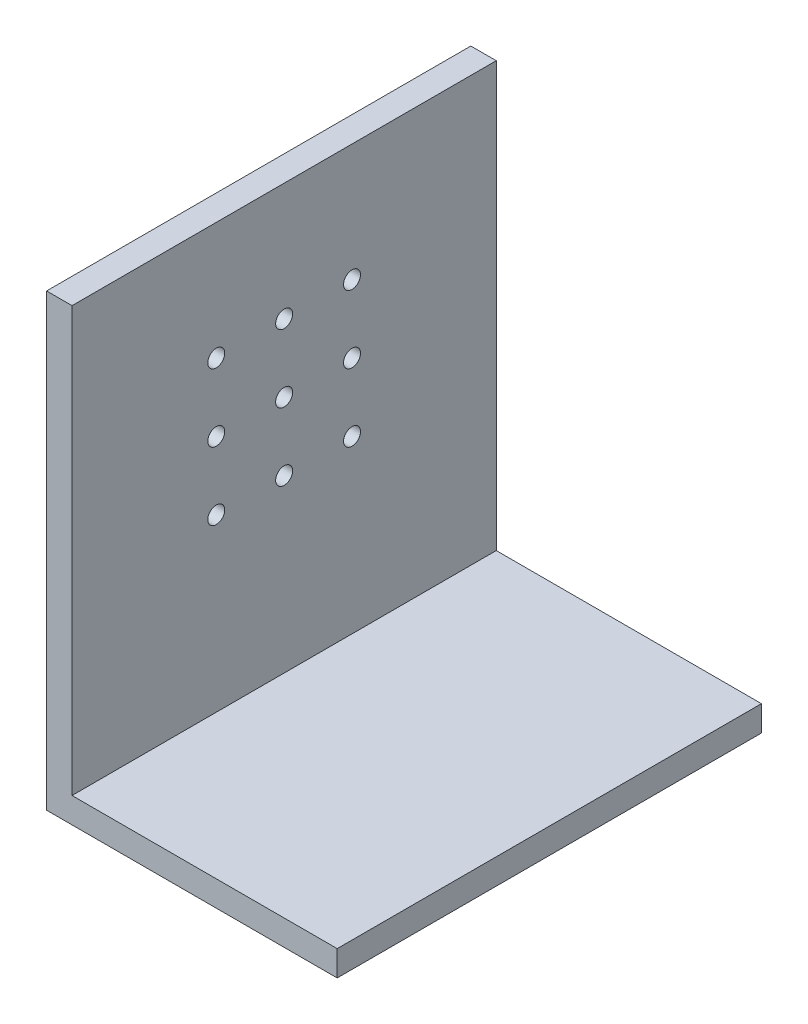
ISO-10303-21;
HEADER;
FILE_DESCRIPTION(('STEP AP214'),'2;1');
FILE_NAME('part.step','',(''),(''),'','','');
FILE_SCHEMA(('AUTOMOTIVE_DESIGN { 1 0 10303 214 1 1 1 1 }'));
ENDSEC;
DATA;
#1=APPLICATION_CONTEXT('core data for automotive mechanical design processes');
#2=APPLICATION_PROTOCOL_DEFINITION('international standard','automotive_design',2000,#1);
#3=PRODUCT_CONTEXT('',#1,'mechanical');
#4=PRODUCT('Part','Part','',(#3));
#5=PRODUCT_RELATED_PRODUCT_CATEGORY('part','',(#4));
#6=PRODUCT_DEFINITION_FORMATION('','',#4);
#7=PRODUCT_DEFINITION_CONTEXT('part definition',#1,'design');
#8=PRODUCT_DEFINITION('design','',#6,#7);
#9=PRODUCT_DEFINITION_SHAPE('','',#8);
#10=(LENGTH_UNIT() NAMED_UNIT(*) SI_UNIT(.MILLI.,.METRE.));
#11=(NAMED_UNIT(*) PLANE_ANGLE_UNIT() SI_UNIT($,.RADIAN.));
#12=(NAMED_UNIT(*) SI_UNIT($,.STERADIAN.) SOLID_ANGLE_UNIT());
#13=UNCERTAINTY_MEASURE_WITH_UNIT(LENGTH_MEASURE(1.E-05),#10,'distance_accuracy_value','');
#14=(GEOMETRIC_REPRESENTATION_CONTEXT(3) GLOBAL_UNCERTAINTY_ASSIGNED_CONTEXT((#13)) GLOBAL_UNIT_ASSIGNED_CONTEXT((#10,
#11,#12)) REPRESENTATION_CONTEXT('',''));
#15=CARTESIAN_POINT('',(0.,0.,0.));
#16=DIRECTION('',(0.,0.,1.));
#17=DIRECTION('',(1.,0.,0.));
#18=AXIS2_PLACEMENT_3D('',#15,#16,#17);
#19=CARTESIAN_POINT('',(0.,3.,-25.));
#20=DIRECTION('',(1.,0.,0.));
#21=DIRECTION('',(0.,0.,-1.));
#22=AXIS2_PLACEMENT_3D('',#19,#20,#21);
#23=PLANE('',#22);
#24=CARTESIAN_POINT('',(0.,31.1560690130177,0.));
#25=DIRECTION('',(-1.,0.,0.));
#26=DIRECTION('',(0.,0.,1.));
#27=AXIS2_PLACEMENT_3D('',#24,#25,#26);
#28=CIRCLE('',#27,1.);
#29=CARTESIAN_POINT('',(0.,31.1560690130177,1.));
#30=VERTEX_POINT('',#29);
#31=EDGE_CURVE('E346',#30,#30,#28,.T.);
#32=ORIENTED_EDGE('',*,*,#31,.F.);
#33=EDGE_LOOP('',(#32));
#34=FACE_BOUND('',#33,.T.);
#35=CARTESIAN_POINT('',(0.,31.1560690130177,-8.));
#36=DIRECTION('',(-1.,0.,0.));
#37=DIRECTION('',(0.,0.,1.));
#38=AXIS2_PLACEMENT_3D('',#35,#36,#37);
#39=CIRCLE('',#38,1.);
#40=CARTESIAN_POINT('',(0.,31.1560690130177,-7.));
#41=VERTEX_POINT('',#40);
#42=EDGE_CURVE('E340',#41,#41,#39,.T.);
#43=ORIENTED_EDGE('',*,*,#42,.F.);
#44=EDGE_LOOP('',(#43));
#45=FACE_BOUND('',#44,.T.);
#46=CARTESIAN_POINT('',(0.,31.1560690130177,8.));
#47=DIRECTION('',(-1.,0.,0.));
#48=DIRECTION('',(0.,0.,1.));
#49=AXIS2_PLACEMENT_3D('',#46,#47,#48);
#50=CIRCLE('',#49,1.);
#51=CARTESIAN_POINT('',(0.,31.1560690130177,9.));
#52=VERTEX_POINT('',#51);
#53=EDGE_CURVE('E334',#52,#52,#50,.T.);
#54=ORIENTED_EDGE('',*,*,#53,.F.);
#55=EDGE_LOOP('',(#54));
#56=FACE_BOUND('',#55,.T.);
#57=CARTESIAN_POINT('',(0.,39.1560690130177,0.));
#58=DIRECTION('',(-1.,0.,0.));
#59=DIRECTION('',(0.,0.,1.));
#60=AXIS2_PLACEMENT_3D('',#57,#58,#59);
#61=CIRCLE('',#60,1.);
#62=CARTESIAN_POINT('',(0.,39.1560690130177,1.));
#63=VERTEX_POINT('',#62);
#64=EDGE_CURVE('E329',#63,#63,#61,.T.);
#65=ORIENTED_EDGE('',*,*,#64,.F.);
#66=EDGE_LOOP('',(#65));
#67=FACE_BOUND('',#66,.T.);
#68=CARTESIAN_POINT('',(0.,39.1560690130177,-8.));
#69=DIRECTION('',(-1.,0.,0.));
#70=DIRECTION('',(0.,0.,1.));
#71=AXIS2_PLACEMENT_3D('',#68,#69,#70);
#72=CIRCLE('',#71,1.);
#73=CARTESIAN_POINT('',(0.,39.1560690130177,-7.));
#74=VERTEX_POINT('',#73);
#75=EDGE_CURVE('E150',#74,#74,#72,.T.);
#76=ORIENTED_EDGE('',*,*,#75,.F.);
#77=EDGE_LOOP('',(#76));
#78=FACE_BOUND('',#77,.T.);
#79=DIRECTION('',(0.,0.,1.));
#80=VECTOR('',#79,1.);
#81=CARTESIAN_POINT('',(0.,0.,-25.));
#82=LINE('',#81,#80);
#83=CARTESIAN_POINT('',(0.,0.,-25.));
#84=VERTEX_POINT('',#83);
#85=CARTESIAN_POINT('',(0.,0.,25.));
#86=VERTEX_POINT('',#85);
#87=EDGE_CURVE('E95',#84,#86,#82,.T.);
#88=ORIENTED_EDGE('',*,*,#87,.T.);
#89=DIRECTION('',(0.,-1.,0.));
#90=VECTOR('',#89,1.);
#91=CARTESIAN_POINT('',(0.,3.,25.));
#92=LINE('',#91,#90);
#93=CARTESIAN_POINT('',(0.,53.,25.));
#94=VERTEX_POINT('',#93);
#95=EDGE_CURVE('E118',#94,#86,#92,.T.);
#96=ORIENTED_EDGE('',*,*,#95,.F.);
#97=DIRECTION('',(0.,0.,1.));
#98=VECTOR('',#97,1.);
#99=CARTESIAN_POINT('',(0.,53.,-25.));
#100=LINE('',#99,#98);
#101=CARTESIAN_POINT('',(0.,53.,-25.));
#102=VERTEX_POINT('',#101);
#103=EDGE_CURVE('E97',#102,#94,#100,.T.);
#104=ORIENTED_EDGE('',*,*,#103,.F.);
#105=DIRECTION('',(0.,-1.,0.));
#106=VECTOR('',#105,1.);
#107=CARTESIAN_POINT('',(0.,3.,-25.));
#108=LINE('',#107,#106);
#109=EDGE_CURVE('E80',#102,#84,#108,.T.);
#110=ORIENTED_EDGE('',*,*,#109,.T.);
#111=EDGE_LOOP('',(#88,#96,#104,#110));
#112=FACE_BOUND('',#111,.T.);
#113=CARTESIAN_POINT('',(0.,39.1560690130177,8.));
#114=DIRECTION('',(-1.,0.,0.));
#115=DIRECTION('',(0.,0.,1.));
#116=AXIS2_PLACEMENT_3D('',#113,#114,#115);
#117=CIRCLE('',#116,1.);
#118=CARTESIAN_POINT('',(0.,39.1560690130177,9.));
#119=VERTEX_POINT('',#118);
#120=EDGE_CURVE('E120',#119,#119,#117,.T.);
#121=ORIENTED_EDGE('',*,*,#120,.F.);
#122=EDGE_LOOP('',(#121));
#123=FACE_BOUND('',#122,.T.);
#124=CARTESIAN_POINT('',(0.,23.1560690130177,8.));
#125=DIRECTION('',(-1.,0.,0.));
#126=DIRECTION('',(0.,0.,1.));
#127=AXIS2_PLACEMENT_3D('',#124,#125,#126);
#128=CIRCLE('',#127,1.);
#129=CARTESIAN_POINT('',(0.,23.1560690130177,9.));
#130=VERTEX_POINT('',#129);
#131=EDGE_CURVE('E156',#130,#130,#128,.T.);
#132=ORIENTED_EDGE('',*,*,#131,.F.);
#133=EDGE_LOOP('',(#132));
#134=FACE_BOUND('',#133,.T.);
#135=CARTESIAN_POINT('',(0.,23.1560690130177,-8.));
#136=DIRECTION('',(-1.,0.,0.));
#137=DIRECTION('',(0.,0.,1.));
#138=AXIS2_PLACEMENT_3D('',#135,#136,#137);
#139=CIRCLE('',#138,1.);
#140=CARTESIAN_POINT('',(0.,23.1560690130177,-7.));
#141=VERTEX_POINT('',#140);
#142=EDGE_CURVE('E162',#141,#141,#139,.T.);
#143=ORIENTED_EDGE('',*,*,#142,.F.);
#144=EDGE_LOOP('',(#143));
#145=FACE_BOUND('',#144,.T.);
#146=CARTESIAN_POINT('',(0.,23.1560690130177,0.));
#147=DIRECTION('',(-1.,0.,0.));
#148=DIRECTION('',(0.,0.,1.));
#149=AXIS2_PLACEMENT_3D('',#146,#147,#148);
#150=CIRCLE('',#149,1.);
#151=CARTESIAN_POINT('',(0.,23.1560690130177,1.));
#152=VERTEX_POINT('',#151);
#153=EDGE_CURVE('E43',#152,#152,#150,.T.);
#154=ORIENTED_EDGE('',*,*,#153,.F.);
#155=EDGE_LOOP('',(#154));
#156=FACE_BOUND('',#155,.T.);
#157=ADVANCED_FACE('F35',(#34,#45,#56,#67,#78,#112,#123,#134,#145,#156),#23,.F.);
#158=CARTESIAN_POINT('',(0.,3.,25.));
#159=DIRECTION('',(0.,0.,-1.));
#160=DIRECTION('',(-1.,0.,0.));
#161=AXIS2_PLACEMENT_3D('',#158,#159,#160);
#162=PLANE('',#161);
#163=DIRECTION('',(1.,0.,0.));
#164=VECTOR('',#163,1.);
#165=CARTESIAN_POINT('',(0.,0.,25.));
#166=LINE('',#165,#164);
#167=CARTESIAN_POINT('',(34.251173864064,0.,25.));
#168=VERTEX_POINT('',#167);
#169=EDGE_CURVE('E101',#86,#168,#166,.T.);
#170=ORIENTED_EDGE('',*,*,#169,.T.);
#171=DIRECTION('',(0.,-1.,0.));
#172=VECTOR('',#171,1.);
#173=CARTESIAN_POINT('',(34.251173864064,3.,25.));
#174=LINE('',#173,#172);
#175=CARTESIAN_POINT('',(34.251173864064,3.,25.));
#176=VERTEX_POINT('',#175);
#177=EDGE_CURVE('E115',#176,#168,#174,.T.);
#178=ORIENTED_EDGE('',*,*,#177,.F.);
#179=DIRECTION('',(1.,0.,0.));
#180=VECTOR('',#179,1.);
#181=CARTESIAN_POINT('',(0.,3.,25.));
#182=LINE('',#181,#180);
#183=CARTESIAN_POINT('',(3.,3.,25.));
#184=VERTEX_POINT('',#183);
#185=EDGE_CURVE('E87',#184,#176,#182,.T.);
#186=ORIENTED_EDGE('',*,*,#185,.F.);
#187=DIRECTION('',(0.,-1.,0.));
#188=VECTOR('',#187,1.);
#189=CARTESIAN_POINT('',(3.00000000000001,53.,25.));
#190=LINE('',#189,#188);
#191=CARTESIAN_POINT('',(3.00000000000001,53.,25.));
#192=VERTEX_POINT('',#191);
#193=EDGE_CURVE('E103',#192,#184,#190,.T.);
#194=ORIENTED_EDGE('',*,*,#193,.F.);
#195=DIRECTION('',(1.,0.,0.));
#196=VECTOR('',#195,1.);
#197=CARTESIAN_POINT('',(0.,53.,25.));
#198=LINE('',#197,#196);
#199=EDGE_CURVE('E313',#94,#192,#198,.T.);
#200=ORIENTED_EDGE('',*,*,#199,.F.);
#201=ORIENTED_EDGE('',*,*,#95,.T.);
#202=EDGE_LOOP('',(#170,#178,#186,#194,#200,#201));
#203=FACE_BOUND('',#202,.T.);
#204=ADVANCED_FACE('F173',(#203),#162,.F.);
#205=CARTESIAN_POINT('',(34.251173864064,3.,-25.));
#206=DIRECTION('',(-1.,0.,0.));
#207=DIRECTION('',(0.,0.,1.));
#208=AXIS2_PLACEMENT_3D('',#205,#206,#207);
#209=PLANE('',#208);
#210=DIRECTION('',(0.,0.,-1.));
#211=VECTOR('',#210,1.);
#212=CARTESIAN_POINT('',(34.251173864064,0.,-25.));
#213=LINE('',#212,#211);
#214=CARTESIAN_POINT('',(34.251173864064,0.,-25.));
#215=VERTEX_POINT('',#214);
#216=EDGE_CURVE('E88',#168,#215,#213,.T.);
#217=ORIENTED_EDGE('',*,*,#216,.T.);
#218=DIRECTION('',(0.,-1.,0.));
#219=VECTOR('',#218,1.);
#220=CARTESIAN_POINT('',(34.251173864064,3.,-25.));
#221=LINE('',#220,#219);
#222=CARTESIAN_POINT('',(34.251173864064,3.,-25.));
#223=VERTEX_POINT('',#222);
#224=EDGE_CURVE('E83',#223,#215,#221,.T.);
#225=ORIENTED_EDGE('',*,*,#224,.F.);
#226=DIRECTION('',(0.,0.,-1.));
#227=VECTOR('',#226,1.);
#228=CARTESIAN_POINT('',(34.251173864064,3.,-25.));
#229=LINE('',#228,#227);
#230=EDGE_CURVE('E56',#176,#223,#229,.T.);
#231=ORIENTED_EDGE('',*,*,#230,.F.);
#232=ORIENTED_EDGE('',*,*,#177,.T.);
#233=EDGE_LOOP('',(#217,#225,#231,#232));
#234=FACE_BOUND('',#233,.T.);
#235=ADVANCED_FACE('F181',(#234),#209,.F.);
#236=CARTESIAN_POINT('',(0.,3.,-25.));
#237=DIRECTION('',(0.,0.,1.));
#238=DIRECTION('',(1.,0.,0.));
#239=AXIS2_PLACEMENT_3D('',#236,#237,#238);
#240=PLANE('',#239);
#241=DIRECTION('',(-1.,0.,0.));
#242=VECTOR('',#241,1.);
#243=CARTESIAN_POINT('',(0.,0.,-25.));
#244=LINE('',#243,#242);
#245=EDGE_CURVE('E76',#215,#84,#244,.T.);
#246=ORIENTED_EDGE('',*,*,#245,.T.);
#247=ORIENTED_EDGE('',*,*,#109,.F.);
#248=DIRECTION('',(-1.,0.,0.));
#249=VECTOR('',#248,1.);
#250=CARTESIAN_POINT('',(0.,53.,-25.));
#251=LINE('',#250,#249);
#252=CARTESIAN_POINT('',(3.,53.,-25.));
#253=VERTEX_POINT('',#252);
#254=EDGE_CURVE('E140',#253,#102,#251,.T.);
#255=ORIENTED_EDGE('',*,*,#254,.F.);
#256=DIRECTION('',(0.,-1.,0.));
#257=VECTOR('',#256,1.);
#258=CARTESIAN_POINT('',(3.,53.,-25.));
#259=LINE('',#258,#257);
#260=CARTESIAN_POINT('',(3.,3.,-25.));
#261=VERTEX_POINT('',#260);
#262=EDGE_CURVE('E107',#253,#261,#259,.T.);
#263=ORIENTED_EDGE('',*,*,#262,.T.);
#264=DIRECTION('',(-1.,0.,0.));
#265=VECTOR('',#264,1.);
#266=CARTESIAN_POINT('',(0.,3.,-25.));
#267=LINE('',#266,#265);
#268=EDGE_CURVE('E98',#223,#261,#267,.T.);
#269=ORIENTED_EDGE('',*,*,#268,.F.);
#270=ORIENTED_EDGE('',*,*,#224,.T.);
#271=EDGE_LOOP('',(#246,#247,#255,#263,#269,#270));
#272=FACE_BOUND('',#271,.T.);
#273=ADVANCED_FACE('F78',(#272),#240,.F.);
#274=CARTESIAN_POINT('',(0.,3.,0.));
#275=DIRECTION('',(0.,1.,0.));
#276=DIRECTION('',(0.,0.,1.));
#277=AXIS2_PLACEMENT_3D('',#274,#275,#276);
#278=PLANE('',#277);
#279=DIRECTION('',(0.,0.,-1.));
#280=VECTOR('',#279,1.);
#281=CARTESIAN_POINT('',(3.,3.,-25.));
#282=LINE('',#281,#280);
#283=EDGE_CURVE('E50',#184,#261,#282,.T.);
#284=ORIENTED_EDGE('',*,*,#283,.F.);
#285=ORIENTED_EDGE('',*,*,#185,.T.);
#286=ORIENTED_EDGE('',*,*,#230,.T.);
#287=ORIENTED_EDGE('',*,*,#268,.T.);
#288=EDGE_LOOP('',(#284,#285,#286,#287));
#289=FACE_BOUND('',#288,.T.);
#290=ADVANCED_FACE('F129',(#289),#278,.T.);
#291=CARTESIAN_POINT('',(0.,0.,0.));
#292=DIRECTION('',(0.,1.,0.));
#293=DIRECTION('',(0.,0.,1.));
#294=AXIS2_PLACEMENT_3D('',#291,#292,#293);
#295=PLANE('',#294);
#296=ORIENTED_EDGE('',*,*,#87,.F.);
#297=ORIENTED_EDGE('',*,*,#245,.F.);
#298=ORIENTED_EDGE('',*,*,#216,.F.);
#299=ORIENTED_EDGE('',*,*,#169,.F.);
#300=EDGE_LOOP('',(#296,#297,#298,#299));
#301=FACE_BOUND('',#300,.T.);
#302=ADVANCED_FACE('F100',(#301),#295,.F.);
#303=CARTESIAN_POINT('',(3.,53.,-25.));
#304=DIRECTION('',(-1.,0.,0.));
#305=DIRECTION('',(0.,0.,1.));
#306=AXIS2_PLACEMENT_3D('',#303,#304,#305);
#307=PLANE('',#306);
#308=CARTESIAN_POINT('',(3.,31.1560690130177,0.));
#309=DIRECTION('',(-1.,0.,0.));
#310=DIRECTION('',(0.,0.,1.));
#311=AXIS2_PLACEMENT_3D('',#308,#309,#310);
#312=CIRCLE('',#311,1.);
#313=CARTESIAN_POINT('',(3.,31.1560690130177,1.));
#314=VERTEX_POINT('',#313);
#315=EDGE_CURVE('E343',#314,#314,#312,.T.);
#316=ORIENTED_EDGE('',*,*,#315,.T.);
#317=EDGE_LOOP('',(#316));
#318=FACE_BOUND('',#317,.T.);
#319=CARTESIAN_POINT('',(3.,31.1560690130177,-8.));
#320=DIRECTION('',(-1.,0.,0.));
#321=DIRECTION('',(0.,0.,1.));
#322=AXIS2_PLACEMENT_3D('',#319,#320,#321);
#323=CIRCLE('',#322,1.);
#324=CARTESIAN_POINT('',(3.,31.1560690130177,-7.));
#325=VERTEX_POINT('',#324);
#326=EDGE_CURVE('E337',#325,#325,#323,.T.);
#327=ORIENTED_EDGE('',*,*,#326,.T.);
#328=EDGE_LOOP('',(#327));
#329=FACE_BOUND('',#328,.T.);
#330=CARTESIAN_POINT('',(3.,31.1560690130177,8.));
#331=DIRECTION('',(-1.,0.,0.));
#332=DIRECTION('',(0.,0.,1.));
#333=AXIS2_PLACEMENT_3D('',#330,#331,#332);
#334=CIRCLE('',#333,1.);
#335=CARTESIAN_POINT('',(3.,31.1560690130177,9.));
#336=VERTEX_POINT('',#335);
#337=EDGE_CURVE('E331',#336,#336,#334,.T.);
#338=ORIENTED_EDGE('',*,*,#337,.T.);
#339=EDGE_LOOP('',(#338));
#340=FACE_BOUND('',#339,.T.);
#341=CARTESIAN_POINT('',(3.,39.1560690130177,0.));
#342=DIRECTION('',(-1.,0.,0.));
#343=DIRECTION('',(0.,0.,1.));
#344=AXIS2_PLACEMENT_3D('',#341,#342,#343);
#345=CIRCLE('',#344,1.);
#346=CARTESIAN_POINT('',(3.,39.1560690130177,1.));
#347=VERTEX_POINT('',#346);
#348=EDGE_CURVE('E326',#347,#347,#345,.T.);
#349=ORIENTED_EDGE('',*,*,#348,.T.);
#350=EDGE_LOOP('',(#349));
#351=FACE_BOUND('',#350,.T.);
#352=CARTESIAN_POINT('',(3.,39.1560690130177,-8.));
#353=DIRECTION('',(-1.,0.,0.));
#354=DIRECTION('',(0.,0.,1.));
#355=AXIS2_PLACEMENT_3D('',#352,#353,#354);
#356=CIRCLE('',#355,1.);
#357=CARTESIAN_POINT('',(3.,39.1560690130177,-7.));
#358=VERTEX_POINT('',#357);
#359=EDGE_CURVE('E139',#358,#358,#356,.T.);
#360=ORIENTED_EDGE('',*,*,#359,.T.);
#361=EDGE_LOOP('',(#360));
#362=FACE_BOUND('',#361,.T.);
#363=ORIENTED_EDGE('',*,*,#283,.T.);
#364=ORIENTED_EDGE('',*,*,#262,.F.);
#365=DIRECTION('',(0.,0.,-1.));
#366=VECTOR('',#365,1.);
#367=CARTESIAN_POINT('',(3.,53.,-25.));
#368=LINE('',#367,#366);
#369=EDGE_CURVE('E142',#192,#253,#368,.T.);
#370=ORIENTED_EDGE('',*,*,#369,.F.);
#371=ORIENTED_EDGE('',*,*,#193,.T.);
#372=EDGE_LOOP('',(#363,#364,#370,#371));
#373=FACE_BOUND('',#372,.T.);
#374=CARTESIAN_POINT('',(3.,39.1560690130177,8.));
#375=DIRECTION('',(-1.,0.,0.));
#376=DIRECTION('',(0.,0.,1.));
#377=AXIS2_PLACEMENT_3D('',#374,#375,#376);
#378=CIRCLE('',#377,1.);
#379=CARTESIAN_POINT('',(3.,39.1560690130177,9.));
#380=VERTEX_POINT('',#379);
#381=EDGE_CURVE('E153',#380,#380,#378,.T.);
#382=ORIENTED_EDGE('',*,*,#381,.T.);
#383=EDGE_LOOP('',(#382));
#384=FACE_BOUND('',#383,.T.);
#385=CARTESIAN_POINT('',(3.,23.1560690130177,8.));
#386=DIRECTION('',(-1.,0.,0.));
#387=DIRECTION('',(0.,0.,1.));
#388=AXIS2_PLACEMENT_3D('',#385,#386,#387);
#389=CIRCLE('',#388,1.);
#390=CARTESIAN_POINT('',(3.,23.1560690130177,9.));
#391=VERTEX_POINT('',#390);
#392=EDGE_CURVE('E159',#391,#391,#389,.T.);
#393=ORIENTED_EDGE('',*,*,#392,.T.);
#394=EDGE_LOOP('',(#393));
#395=FACE_BOUND('',#394,.T.);
#396=CARTESIAN_POINT('',(3.,23.1560690130177,-8.));
#397=DIRECTION('',(-1.,0.,0.));
#398=DIRECTION('',(0.,0.,1.));
#399=AXIS2_PLACEMENT_3D('',#396,#397,#398);
#400=CIRCLE('',#399,1.);
#401=CARTESIAN_POINT('',(3.,23.1560690130177,-7.));
#402=VERTEX_POINT('',#401);
#403=EDGE_CURVE('E165',#402,#402,#400,.T.);
#404=ORIENTED_EDGE('',*,*,#403,.T.);
#405=EDGE_LOOP('',(#404));
#406=FACE_BOUND('',#405,.T.);
#407=CARTESIAN_POINT('',(3.,23.1560690130177,0.));
#408=DIRECTION('',(-1.,0.,0.));
#409=DIRECTION('',(0.,0.,1.));
#410=AXIS2_PLACEMENT_3D('',#407,#408,#409);
#411=CIRCLE('',#410,1.);
#412=CARTESIAN_POINT('',(3.,23.1560690130177,1.));
#413=VERTEX_POINT('',#412);
#414=EDGE_CURVE('E11',#413,#413,#411,.T.);
#415=ORIENTED_EDGE('',*,*,#414,.T.);
#416=EDGE_LOOP('',(#415));
#417=FACE_BOUND('',#416,.T.);
#418=ADVANCED_FACE('F134',(#318,#329,#340,#351,#362,#373,#384,#395,#406,#417),#307,.F.);
#419=CARTESIAN_POINT('',(0.,53.,0.));
#420=DIRECTION('',(0.,1.,0.));
#421=DIRECTION('',(0.,0.,1.));
#422=AXIS2_PLACEMENT_3D('',#419,#420,#421);
#423=PLANE('',#422);
#424=ORIENTED_EDGE('',*,*,#103,.T.);
#425=ORIENTED_EDGE('',*,*,#199,.T.);
#426=ORIENTED_EDGE('',*,*,#369,.T.);
#427=ORIENTED_EDGE('',*,*,#254,.T.);
#428=EDGE_LOOP('',(#424,#425,#426,#427));
#429=FACE_BOUND('',#428,.T.);
#430=ADVANCED_FACE('F215',(#429),#423,.T.);
#431=CARTESIAN_POINT('',(50.,39.1560690130177,-8.));
#432=DIRECTION('',(-1.,0.,0.));
#433=DIRECTION('',(0.,0.,1.));
#434=AXIS2_PLACEMENT_3D('',#431,#432,#433);
#435=CYLINDRICAL_SURFACE('',#434,1.);
#436=ORIENTED_EDGE('',*,*,#75,.T.);
#437=EDGE_LOOP('',(#436));
#438=FACE_BOUND('',#437,.T.);
#439=ORIENTED_EDGE('',*,*,#359,.F.);
#440=EDGE_LOOP('',(#439));
#441=FACE_BOUND('',#440,.T.);
#442=ADVANCED_FACE('F272',(#438,#441),#435,.F.);
#443=CARTESIAN_POINT('',(50.,39.1560690130177,0.));
#444=DIRECTION('',(-1.,0.,0.));
#445=DIRECTION('',(0.,0.,1.));
#446=AXIS2_PLACEMENT_3D('',#443,#444,#445);
#447=CYLINDRICAL_SURFACE('',#446,1.);
#448=ORIENTED_EDGE('',*,*,#64,.T.);
#449=EDGE_LOOP('',(#448));
#450=FACE_BOUND('',#449,.T.);
#451=ORIENTED_EDGE('',*,*,#348,.F.);
#452=EDGE_LOOP('',(#451));
#453=FACE_BOUND('',#452,.T.);
#454=ADVANCED_FACE('F192',(#450,#453),#447,.F.);
#455=CARTESIAN_POINT('',(50.,39.1560690130177,8.));
#456=DIRECTION('',(-1.,0.,0.));
#457=DIRECTION('',(0.,0.,1.));
#458=AXIS2_PLACEMENT_3D('',#455,#456,#457);
#459=CYLINDRICAL_SURFACE('',#458,1.);
#460=ORIENTED_EDGE('',*,*,#120,.T.);
#461=EDGE_LOOP('',(#460));
#462=FACE_BOUND('',#461,.T.);
#463=ORIENTED_EDGE('',*,*,#381,.F.);
#464=EDGE_LOOP('',(#463));
#465=FACE_BOUND('',#464,.T.);
#466=ADVANCED_FACE('F188',(#462,#465),#459,.F.);
#467=CARTESIAN_POINT('',(50.,31.1560690130177,8.));
#468=DIRECTION('',(-1.,0.,0.));
#469=DIRECTION('',(0.,0.,1.));
#470=AXIS2_PLACEMENT_3D('',#467,#468,#469);
#471=CYLINDRICAL_SURFACE('',#470,1.);
#472=ORIENTED_EDGE('',*,*,#53,.T.);
#473=EDGE_LOOP('',(#472));
#474=FACE_BOUND('',#473,.T.);
#475=ORIENTED_EDGE('',*,*,#337,.F.);
#476=EDGE_LOOP('',(#475));
#477=FACE_BOUND('',#476,.T.);
#478=ADVANCED_FACE('F191',(#474,#477),#471,.F.);
#479=CARTESIAN_POINT('',(50.,23.1560690130177,8.));
#480=DIRECTION('',(-1.,0.,0.));
#481=DIRECTION('',(0.,0.,1.));
#482=AXIS2_PLACEMENT_3D('',#479,#480,#481);
#483=CYLINDRICAL_SURFACE('',#482,1.);
#484=ORIENTED_EDGE('',*,*,#131,.T.);
#485=EDGE_LOOP('',(#484));
#486=FACE_BOUND('',#485,.T.);
#487=ORIENTED_EDGE('',*,*,#392,.F.);
#488=EDGE_LOOP('',(#487));
#489=FACE_BOUND('',#488,.T.);
#490=ADVANCED_FACE('F194',(#486,#489),#483,.F.);
#491=CARTESIAN_POINT('',(50.,31.1560690130177,-8.));
#492=DIRECTION('',(-1.,0.,0.));
#493=DIRECTION('',(0.,0.,1.));
#494=AXIS2_PLACEMENT_3D('',#491,#492,#493);
#495=CYLINDRICAL_SURFACE('',#494,1.);
#496=ORIENTED_EDGE('',*,*,#42,.T.);
#497=EDGE_LOOP('',(#496));
#498=FACE_BOUND('',#497,.T.);
#499=ORIENTED_EDGE('',*,*,#326,.F.);
#500=EDGE_LOOP('',(#499));
#501=FACE_BOUND('',#500,.T.);
#502=ADVANCED_FACE('F196',(#498,#501),#495,.F.);
#503=CARTESIAN_POINT('',(50.,23.1560690130177,-8.));
#504=DIRECTION('',(-1.,0.,0.));
#505=DIRECTION('',(0.,0.,1.));
#506=AXIS2_PLACEMENT_3D('',#503,#504,#505);
#507=CYLINDRICAL_SURFACE('',#506,1.);
#508=ORIENTED_EDGE('',*,*,#142,.T.);
#509=EDGE_LOOP('',(#508));
#510=FACE_BOUND('',#509,.T.);
#511=ORIENTED_EDGE('',*,*,#403,.F.);
#512=EDGE_LOOP('',(#511));
#513=FACE_BOUND('',#512,.T.);
#514=ADVANCED_FACE('F198',(#510,#513),#507,.F.);
#515=CARTESIAN_POINT('',(50.,31.1560690130177,0.));
#516=DIRECTION('',(-1.,0.,0.));
#517=DIRECTION('',(0.,0.,1.));
#518=AXIS2_PLACEMENT_3D('',#515,#516,#517);
#519=CYLINDRICAL_SURFACE('',#518,1.);
#520=ORIENTED_EDGE('',*,*,#31,.T.);
#521=EDGE_LOOP('',(#520));
#522=FACE_BOUND('',#521,.T.);
#523=ORIENTED_EDGE('',*,*,#315,.F.);
#524=EDGE_LOOP('',(#523));
#525=FACE_BOUND('',#524,.T.);
#526=ADVANCED_FACE('F200',(#522,#525),#519,.F.);
#527=CARTESIAN_POINT('',(50.,23.1560690130177,0.));
#528=DIRECTION('',(-1.,0.,0.));
#529=DIRECTION('',(0.,0.,1.));
#530=AXIS2_PLACEMENT_3D('',#527,#528,#529);
#531=CYLINDRICAL_SURFACE('',#530,1.);
#532=ORIENTED_EDGE('',*,*,#153,.T.);
#533=EDGE_LOOP('',(#532));
#534=FACE_BOUND('',#533,.T.);
#535=ORIENTED_EDGE('',*,*,#414,.F.);
#536=EDGE_LOOP('',(#535));
#537=FACE_BOUND('',#536,.T.);
#538=ADVANCED_FACE('F37',(#534,#537),#531,.F.);
#539=CLOSED_SHELL('',(#157,#204,#235,#273,#290,#302,#418,#430,#442,#454,#466,#478,#490,#502,
#514,#526,#538));
#540=MANIFOLD_SOLID_BREP('B2',#539);
#541=ADVANCED_BREP_SHAPE_REPRESENTATION('',(#18,#540),#14);
#542=SHAPE_DEFINITION_REPRESENTATION(#9,#541);
ENDSEC;
END-ISO-10303-21;
